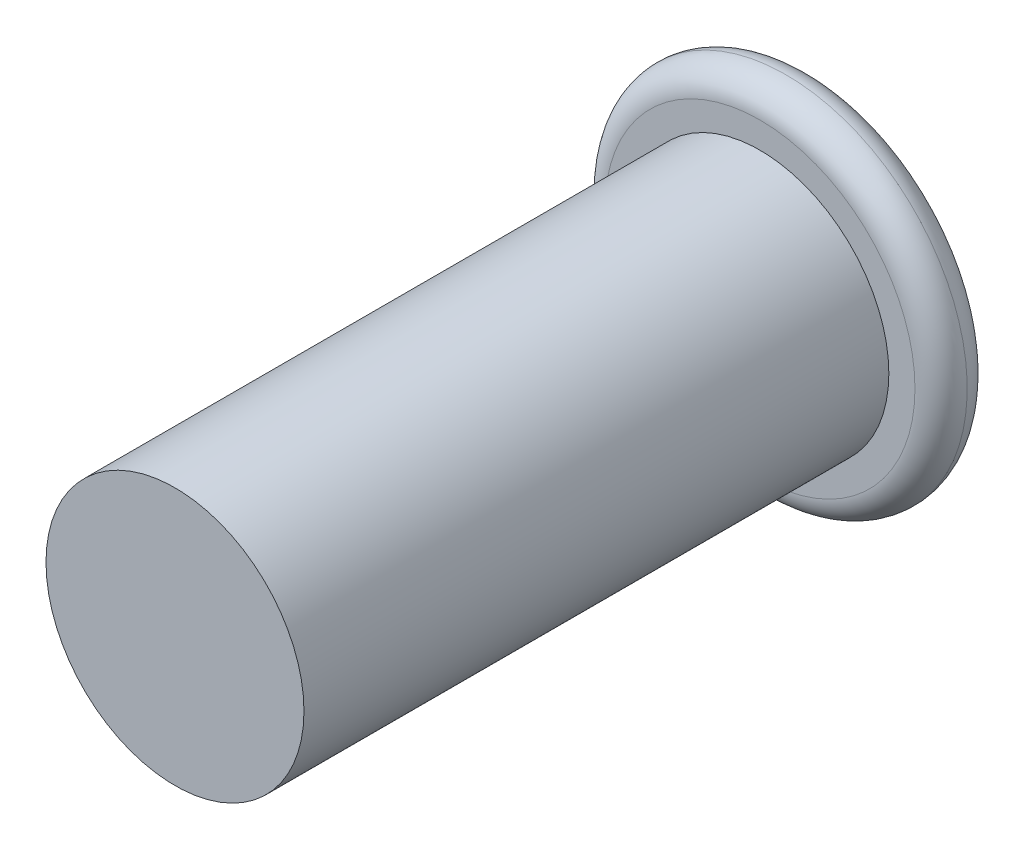
ISO-10303-21;
HEADER;
FILE_DESCRIPTION(('STEP AP214'),'2;1');
FILE_NAME('part.step','',(''),(''),'','','');
FILE_SCHEMA(('AUTOMOTIVE_DESIGN { 1 0 10303 214 1 1 1 1 }'));
ENDSEC;
DATA;
#1=APPLICATION_CONTEXT('core data for automotive mechanical design processes');
#2=APPLICATION_PROTOCOL_DEFINITION('international standard','automotive_design',2000,#1);
#3=PRODUCT_CONTEXT('',#1,'mechanical');
#4=PRODUCT('Part','Part','',(#3));
#5=PRODUCT_RELATED_PRODUCT_CATEGORY('part','',(#4));
#6=PRODUCT_DEFINITION_FORMATION('','',#4);
#7=PRODUCT_DEFINITION_CONTEXT('part definition',#1,'design');
#8=PRODUCT_DEFINITION('design','',#6,#7);
#9=PRODUCT_DEFINITION_SHAPE('','',#8);
#10=(LENGTH_UNIT() NAMED_UNIT(*) SI_UNIT(.MILLI.,.METRE.));
#11=(NAMED_UNIT(*) PLANE_ANGLE_UNIT() SI_UNIT($,.RADIAN.));
#12=(NAMED_UNIT(*) SI_UNIT($,.STERADIAN.) SOLID_ANGLE_UNIT());
#13=UNCERTAINTY_MEASURE_WITH_UNIT(LENGTH_MEASURE(1.E-05),#10,'distance_accuracy_value','');
#14=(GEOMETRIC_REPRESENTATION_CONTEXT(3) GLOBAL_UNCERTAINTY_ASSIGNED_CONTEXT((#13)) GLOBAL_UNIT_ASSIGNED_CONTEXT((#10,
#11,#12)) REPRESENTATION_CONTEXT('',''));
#15=CARTESIAN_POINT('',(0.,0.,0.));
#16=DIRECTION('',(0.,0.,1.));
#17=DIRECTION('',(1.,0.,0.));
#18=AXIS2_PLACEMENT_3D('',#15,#16,#17);
#19=CARTESIAN_POINT('',(0.,0.,5.6));
#20=DIRECTION('',(0.,0.,-1.));
#21=DIRECTION('',(-1.,0.,0.));
#22=AXIS2_PLACEMENT_3D('',#19,#20,#21);
#23=CYLINDRICAL_SURFACE('',#22,1.235);
#24=CARTESIAN_POINT('',(0.,0.,5.6));
#25=DIRECTION('',(0.,0.,1.));
#26=DIRECTION('',(1.,0.,0.));
#27=AXIS2_PLACEMENT_3D('',#24,#25,#26);
#28=CIRCLE('',#27,1.235);
#29=CARTESIAN_POINT('',(1.235,0.,5.6));
#30=VERTEX_POINT('',#29);
#31=EDGE_CURVE('E51',#30,#30,#28,.T.);
#32=ORIENTED_EDGE('',*,*,#31,.F.);
#33=EDGE_LOOP('',(#32));
#34=FACE_BOUND('',#33,.T.);
#35=CARTESIAN_POINT('',(0.,0.,0.));
#36=DIRECTION('',(0.,0.,1.));
#37=DIRECTION('',(1.,0.,0.));
#38=AXIS2_PLACEMENT_3D('',#35,#36,#37);
#39=CIRCLE('',#38,1.235);
#40=CARTESIAN_POINT('',(1.235,0.,0.));
#41=VERTEX_POINT('',#40);
#42=EDGE_CURVE('E54',#41,#41,#39,.T.);
#43=ORIENTED_EDGE('',*,*,#42,.T.);
#44=EDGE_LOOP('',(#43));
#45=FACE_BOUND('',#44,.T.);
#46=ADVANCED_FACE('F39',(#34,#45),#23,.T.);
#47=CARTESIAN_POINT('',(0.,0.,5.6));
#48=DIRECTION('',(0.,0.,1.));
#49=DIRECTION('',(1.,0.,0.));
#50=AXIS2_PLACEMENT_3D('',#47,#48,#49);
#51=PLANE('',#50);
#52=ORIENTED_EDGE('',*,*,#31,.T.);
#53=EDGE_LOOP('',(#52));
#54=FACE_BOUND('',#53,.T.);
#55=ADVANCED_FACE('F60',(#54),#51,.T.);
#56=CARTESIAN_POINT('',(0.,0.,-0.5));
#57=DIRECTION('',(0.,0.,-1.));
#58=DIRECTION('',(-1.,0.,0.));
#59=AXIS2_PLACEMENT_3D('',#56,#57,#58);
#60=PLANE('',#59);
#61=CARTESIAN_POINT('',(0.,0.,-0.5));
#62=DIRECTION('',(0.,0.,-1.));
#63=DIRECTION('',(-1.,0.,0.));
#64=AXIS2_PLACEMENT_3D('',#61,#62,#63);
#65=CIRCLE('',#64,1.485);
#66=CARTESIAN_POINT('',(-1.485,0.,-0.5));
#67=VERTEX_POINT('',#66);
#68=EDGE_CURVE('E10',#67,#67,#65,.T.);
#69=ORIENTED_EDGE('',*,*,#68,.T.);
#70=EDGE_LOOP('',(#69));
#71=FACE_BOUND('',#70,.T.);
#72=ADVANCED_FACE('F69',(#71),#60,.T.);
#73=CARTESIAN_POINT('',(0.,0.,0.));
#74=DIRECTION('',(0.,0.,-1.));
#75=DIRECTION('',(-1.,0.,0.));
#76=AXIS2_PLACEMENT_3D('',#73,#74,#75);
#77=PLANE('',#76);
#78=CARTESIAN_POINT('',(0.,0.,0.));
#79=DIRECTION('',(0.,0.,-1.));
#80=DIRECTION('',(-1.,0.,0.));
#81=AXIS2_PLACEMENT_3D('',#78,#79,#80);
#82=CIRCLE('',#81,1.485);
#83=CARTESIAN_POINT('',(-1.485,0.,0.));
#84=VERTEX_POINT('',#83);
#85=EDGE_CURVE('E47',#84,#84,#82,.F.);
#86=ORIENTED_EDGE('',*,*,#85,.T.);
#87=EDGE_LOOP('',(#86));
#88=FACE_BOUND('',#87,.T.);
#89=ORIENTED_EDGE('',*,*,#42,.F.);
#90=EDGE_LOOP('',(#89));
#91=FACE_BOUND('',#90,.T.);
#92=ADVANCED_FACE('F67',(#88,#91),#77,.F.);
#93=CARTESIAN_POINT('',(0.,0.,-0.25));
#94=DIRECTION('',(0.,0.,-1.));
#95=DIRECTION('',(-1.,0.,0.));
#96=AXIS2_PLACEMENT_3D('',#93,#94,#95);
#97=TOROIDAL_SURFACE('',#96,1.485,0.25);
#98=ORIENTED_EDGE('',*,*,#68,.F.);
#99=EDGE_LOOP('',(#98));
#100=FACE_BOUND('',#99,.T.);
#101=CARTESIAN_POINT('',(0.,0.,-0.25));
#102=DIRECTION('',(0.,0.,-1.));
#103=DIRECTION('',(-1.,0.,0.));
#104=AXIS2_PLACEMENT_3D('',#101,#102,#103);
#105=CIRCLE('',#104,1.735);
#106=CARTESIAN_POINT('',(-1.735,0.,-0.25));
#107=VERTEX_POINT('',#106);
#108=EDGE_CURVE('E43',#107,#107,#105,.F.);
#109=ORIENTED_EDGE('',*,*,#108,.F.);
#110=EDGE_LOOP('',(#109));
#111=FACE_BOUND('',#110,.T.);
#112=ADVANCED_FACE('F41',(#100,#111),#97,.T.);
#113=CARTESIAN_POINT('',(0.,0.,-0.25));
#114=DIRECTION('',(0.,0.,-1.));
#115=DIRECTION('',(-1.,0.,0.));
#116=AXIS2_PLACEMENT_3D('',#113,#114,#115);
#117=TOROIDAL_SURFACE('',#116,1.485,0.25);
#118=ORIENTED_EDGE('',*,*,#85,.F.);
#119=EDGE_LOOP('',(#118));
#120=FACE_BOUND('',#119,.T.);
#121=ORIENTED_EDGE('',*,*,#108,.T.);
#122=EDGE_LOOP('',(#121));
#123=FACE_BOUND('',#122,.T.);
#124=ADVANCED_FACE('F76',(#120,#123),#117,.T.);
#125=CLOSED_SHELL('',(#46,#55,#72,#92,#112,#124));
#126=MANIFOLD_SOLID_BREP('B2',#125);
#127=ADVANCED_BREP_SHAPE_REPRESENTATION('',(#18,#126),#14);
#128=SHAPE_DEFINITION_REPRESENTATION(#9,#127);
ENDSEC;
END-ISO-10303-21;
